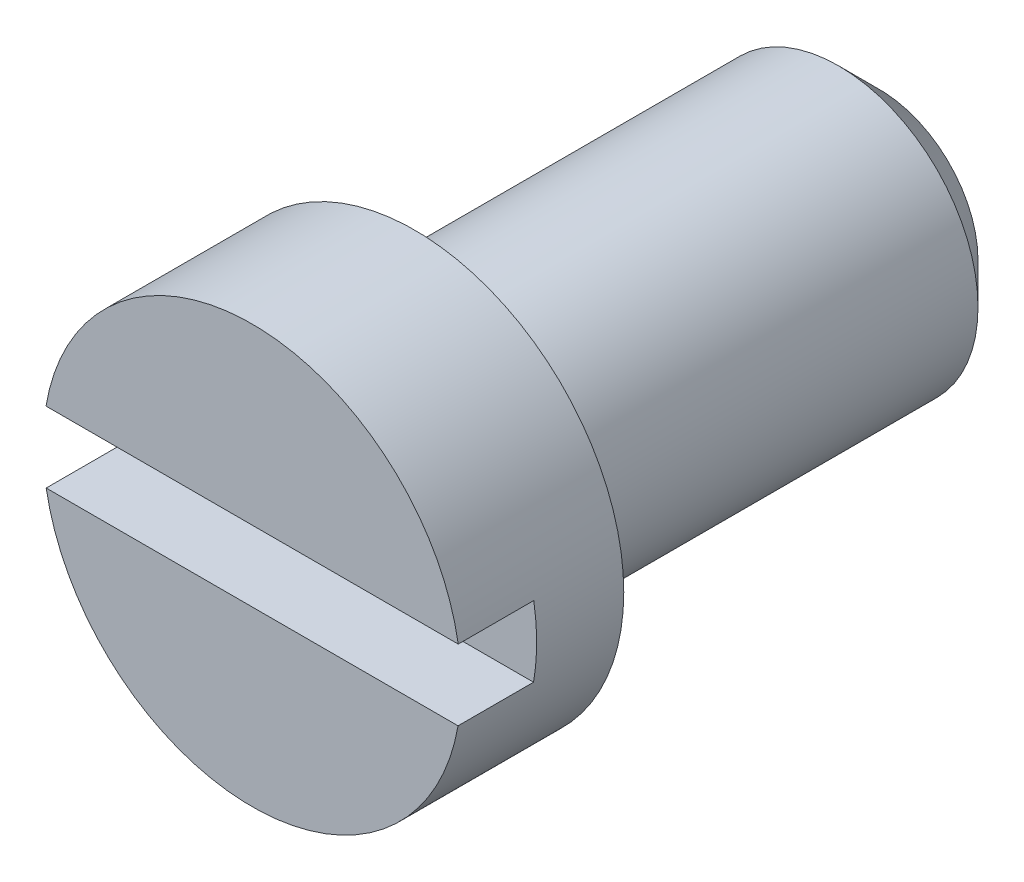
ISO-10303-21;
HEADER;
FILE_DESCRIPTION(('STEP AP214'),'2;1');
FILE_NAME('part.step','',(''),(''),'','','');
FILE_SCHEMA(('AUTOMOTIVE_DESIGN { 1 0 10303 214 1 1 1 1 }'));
ENDSEC;
DATA;
#1=APPLICATION_CONTEXT('core data for automotive mechanical design processes');
#2=APPLICATION_PROTOCOL_DEFINITION('international standard','automotive_design',2000,#1);
#3=PRODUCT_CONTEXT('',#1,'mechanical');
#4=PRODUCT('Part','Part','',(#3));
#5=PRODUCT_RELATED_PRODUCT_CATEGORY('part','',(#4));
#6=PRODUCT_DEFINITION_FORMATION('','',#4);
#7=PRODUCT_DEFINITION_CONTEXT('part definition',#1,'design');
#8=PRODUCT_DEFINITION('design','',#6,#7);
#9=PRODUCT_DEFINITION_SHAPE('','',#8);
#10=(LENGTH_UNIT() NAMED_UNIT(*) SI_UNIT(.MILLI.,.METRE.));
#11=(NAMED_UNIT(*) PLANE_ANGLE_UNIT() SI_UNIT($,.RADIAN.));
#12=(NAMED_UNIT(*) SI_UNIT($,.STERADIAN.) SOLID_ANGLE_UNIT());
#13=UNCERTAINTY_MEASURE_WITH_UNIT(LENGTH_MEASURE(1.E-05),#10,'distance_accuracy_value','');
#14=(GEOMETRIC_REPRESENTATION_CONTEXT(3) GLOBAL_UNCERTAINTY_ASSIGNED_CONTEXT((#13)) GLOBAL_UNIT_ASSIGNED_CONTEXT((#10,
#11,#12)) REPRESENTATION_CONTEXT('',''));
#15=CARTESIAN_POINT('',(0.,0.,0.));
#16=DIRECTION('',(0.,0.,1.));
#17=DIRECTION('',(1.,0.,0.));
#18=AXIS2_PLACEMENT_3D('',#15,#16,#17);
#19=CARTESIAN_POINT('',(0.,0.,7.));
#20=DIRECTION('',(0.,0.,1.));
#21=DIRECTION('',(1.,0.,0.));
#22=AXIS2_PLACEMENT_3D('',#19,#20,#21);
#23=PLANE('',#22);
#24=DIRECTION('',(-1.,0.,0.));
#25=VECTOR('',#24,1.);
#26=CARTESIAN_POINT('',(0.,1.5,7.));
#27=LINE('',#26,#25);
#28=CARTESIAN_POINT('',(8.87411967464942,1.5,7.));
#29=VERTEX_POINT('',#28);
#30=CARTESIAN_POINT('',(-8.87411967464942,1.5,7.));
#31=VERTEX_POINT('',#30);
#32=EDGE_CURVE('E77',#29,#31,#27,.T.);
#33=ORIENTED_EDGE('',*,*,#32,.F.);
#34=CARTESIAN_POINT('',(0.,0.,7.));
#35=DIRECTION('',(0.,0.,1.));
#36=DIRECTION('',(1.,0.,0.));
#37=AXIS2_PLACEMENT_3D('',#34,#35,#36);
#38=CIRCLE('',#37,9.);
#39=EDGE_CURVE('E90',#29,#31,#38,.T.);
#40=ORIENTED_EDGE('',*,*,#39,.T.);
#41=EDGE_LOOP('',(#33,#40));
#42=FACE_BOUND('',#41,.T.);
#43=ADVANCED_FACE('F29',(#42),#23,.T.);
#44=CARTESIAN_POINT('',(0.,0.,0.));
#45=DIRECTION('',(0.,0.,1.));
#46=DIRECTION('',(1.,0.,0.));
#47=AXIS2_PLACEMENT_3D('',#44,#45,#46);
#48=PLANE('',#47);
#49=CARTESIAN_POINT('',(0.,0.,0.));
#50=DIRECTION('',(0.,0.,1.));
#51=DIRECTION('',(1.,0.,0.));
#52=AXIS2_PLACEMENT_3D('',#49,#50,#51);
#53=CIRCLE('',#52,9.);
#54=CARTESIAN_POINT('',(9.,0.,0.));
#55=VERTEX_POINT('',#54);
#56=EDGE_CURVE('E91',#55,#55,#53,.T.);
#57=ORIENTED_EDGE('',*,*,#56,.F.);
#58=EDGE_LOOP('',(#57));
#59=FACE_BOUND('',#58,.T.);
#60=CARTESIAN_POINT('',(0.,0.,0.));
#61=DIRECTION('',(0.,0.,1.));
#62=DIRECTION('',(1.,0.,0.));
#63=AXIS2_PLACEMENT_3D('',#60,#61,#62);
#64=CIRCLE('',#63,6.);
#65=CARTESIAN_POINT('',(6.,0.,0.));
#66=VERTEX_POINT('',#65);
#67=EDGE_CURVE('E78',#66,#66,#64,.F.);
#68=ORIENTED_EDGE('',*,*,#67,.F.);
#69=EDGE_LOOP('',(#68));
#70=FACE_BOUND('',#69,.T.);
#71=ADVANCED_FACE('F118',(#59,#70),#48,.F.);
#72=CARTESIAN_POINT('',(0.,0.,7.));
#73=DIRECTION('',(0.,0.,-1.));
#74=DIRECTION('',(-1.,0.,0.));
#75=AXIS2_PLACEMENT_3D('',#72,#73,#74);
#76=CYLINDRICAL_SURFACE('',#75,9.);
#77=CARTESIAN_POINT('',(0.,0.,3.75));
#78=DIRECTION('',(0.,0.,1.));
#79=DIRECTION('',(1.,0.,0.));
#80=AXIS2_PLACEMENT_3D('',#77,#78,#79);
#81=CIRCLE('',#80,9.);
#82=CARTESIAN_POINT('',(-8.87411967464942,1.5,3.75));
#83=VERTEX_POINT('',#82);
#84=CARTESIAN_POINT('',(-8.86552310921358,-1.55,3.75));
#85=VERTEX_POINT('',#84);
#86=EDGE_CURVE('E102',#83,#85,#81,.T.);
#87=ORIENTED_EDGE('',*,*,#86,.F.);
#88=DIRECTION('',(0.,0.,-1.));
#89=VECTOR('',#88,1.);
#90=CARTESIAN_POINT('',(-8.87411967464942,1.5,7.));
#91=LINE('',#90,#89);
#92=EDGE_CURVE('E52',#83,#31,#91,.F.);
#93=ORIENTED_EDGE('',*,*,#92,.T.);
#94=ORIENTED_EDGE('',*,*,#39,.F.);
#95=DIRECTION('',(0.,0.,-1.));
#96=VECTOR('',#95,1.);
#97=CARTESIAN_POINT('',(8.87411967464942,1.5,7.));
#98=LINE('',#97,#96);
#99=CARTESIAN_POINT('',(8.87411967464942,1.5,3.75));
#100=VERTEX_POINT('',#99);
#101=EDGE_CURVE('E95',#29,#100,#98,.T.);
#102=ORIENTED_EDGE('',*,*,#101,.T.);
#103=CARTESIAN_POINT('',(8.86552310921358,-1.55,3.75));
#104=VERTEX_POINT('',#103);
#105=EDGE_CURVE('E86',#104,#100,#81,.T.);
#106=ORIENTED_EDGE('',*,*,#105,.F.);
#107=DIRECTION('',(0.,0.,-1.));
#108=VECTOR('',#107,1.);
#109=CARTESIAN_POINT('',(8.86552310921358,-1.55,7.));
#110=LINE('',#109,#108);
#111=CARTESIAN_POINT('',(8.86552310921357,-1.55,7.));
#112=VERTEX_POINT('',#111);
#113=EDGE_CURVE('E72',#104,#112,#110,.F.);
#114=ORIENTED_EDGE('',*,*,#113,.T.);
#115=CARTESIAN_POINT('',(-8.86552310921358,-1.55,7.));
#116=VERTEX_POINT('',#115);
#117=EDGE_CURVE('E84',#116,#112,#38,.T.);
#118=ORIENTED_EDGE('',*,*,#117,.F.);
#119=DIRECTION('',(0.,0.,-1.));
#120=VECTOR('',#119,1.);
#121=CARTESIAN_POINT('',(-8.86552310921358,-1.55,7.));
#122=LINE('',#121,#120);
#123=EDGE_CURVE('E44',#116,#85,#122,.T.);
#124=ORIENTED_EDGE('',*,*,#123,.T.);
#125=EDGE_LOOP('',(#87,#93,#94,#102,#106,#114,#118,#124));
#126=FACE_BOUND('',#125,.T.);
#127=ORIENTED_EDGE('',*,*,#56,.T.);
#128=EDGE_LOOP('',(#127));
#129=FACE_BOUND('',#128,.T.);
#130=ADVANCED_FACE('F31',(#126,#129),#76,.T.);
#131=DIRECTION('',(1.,0.,0.));
#132=VECTOR('',#131,1.);
#133=CARTESIAN_POINT('',(0.,-1.55,7.));
#134=LINE('',#133,#132);
#135=EDGE_CURVE('E69',#116,#112,#134,.T.);
#136=ORIENTED_EDGE('',*,*,#135,.F.);
#137=ORIENTED_EDGE('',*,*,#117,.T.);
#138=EDGE_LOOP('',(#136,#137));
#139=FACE_BOUND('',#138,.T.);
#140=ADVANCED_FACE('F89',(#139),#23,.T.);
#141=CARTESIAN_POINT('',(0.,0.,-20.));
#142=DIRECTION('',(0.,0.,1.));
#143=DIRECTION('',(1.,0.,0.));
#144=AXIS2_PLACEMENT_3D('',#141,#142,#143);
#145=CYLINDRICAL_SURFACE('',#144,6.);
#146=CARTESIAN_POINT('',(0.,0.,-18.25));
#147=DIRECTION('',(0.,0.,-1.));
#148=DIRECTION('',(-1.,0.,0.));
#149=AXIS2_PLACEMENT_3D('',#146,#147,#148);
#150=CIRCLE('',#149,6.);
#151=CARTESIAN_POINT('',(6.,0.,-18.25));
#152=VERTEX_POINT('',#151);
#153=EDGE_CURVE('E11',#152,#152,#150,.F.);
#154=ORIENTED_EDGE('',*,*,#153,.T.);
#155=EDGE_LOOP('',(#154));
#156=FACE_BOUND('',#155,.T.);
#157=ORIENTED_EDGE('',*,*,#67,.T.);
#158=EDGE_LOOP('',(#157));
#159=FACE_BOUND('',#158,.T.);
#160=ADVANCED_FACE('F126',(#156,#159),#145,.T.);
#161=CARTESIAN_POINT('',(0.,0.,-20.));
#162=DIRECTION('',(0.,0.,-1.));
#163=DIRECTION('',(-1.,0.,0.));
#164=AXIS2_PLACEMENT_3D('',#161,#162,#163);
#165=PLANE('',#164);
#166=CARTESIAN_POINT('',(0.,0.,-20.));
#167=DIRECTION('',(0.,0.,-1.));
#168=DIRECTION('',(-1.,0.,0.));
#169=AXIS2_PLACEMENT_3D('',#166,#167,#168);
#170=CIRCLE('',#169,4.25);
#171=CARTESIAN_POINT('',(4.25000000000001,0.,-20.));
#172=VERTEX_POINT('',#171);
#173=EDGE_CURVE('E37',#172,#172,#170,.T.);
#174=ORIENTED_EDGE('',*,*,#173,.T.);
#175=EDGE_LOOP('',(#174));
#176=FACE_BOUND('',#175,.T.);
#177=ADVANCED_FACE('F131',(#176),#165,.T.);
#178=CARTESIAN_POINT('',(-9.55182072829131,-1.55,3.75));
#179=DIRECTION('',(0.,0.,1.));
#180=DIRECTION('',(1.,0.,0.));
#181=AXIS2_PLACEMENT_3D('',#178,#179,#180);
#182=PLANE('',#181);
#183=ORIENTED_EDGE('',*,*,#86,.T.);
#184=DIRECTION('',(1.,0.,0.));
#185=VECTOR('',#184,1.);
#186=CARTESIAN_POINT('',(-9.55182072829131,-1.55,3.75));
#187=LINE('',#186,#185);
#188=EDGE_CURVE('E108',#85,#104,#187,.T.);
#189=ORIENTED_EDGE('',*,*,#188,.T.);
#190=ORIENTED_EDGE('',*,*,#105,.T.);
#191=DIRECTION('',(-1.,0.,0.));
#192=VECTOR('',#191,1.);
#193=CARTESIAN_POINT('',(-9.55182072829131,1.5,3.75));
#194=LINE('',#193,#192);
#195=EDGE_CURVE('E87',#100,#83,#194,.T.);
#196=ORIENTED_EDGE('',*,*,#195,.T.);
#197=EDGE_LOOP('',(#183,#189,#190,#196));
#198=FACE_BOUND('',#197,.T.);
#199=ADVANCED_FACE('F107',(#198),#182,.T.);
#200=CARTESIAN_POINT('',(-9.55182072829131,1.5,3.75));
#201=DIRECTION('',(0.,1.,0.));
#202=DIRECTION('',(0.,0.,1.));
#203=AXIS2_PLACEMENT_3D('',#200,#201,#202);
#204=PLANE('',#203);
#205=ORIENTED_EDGE('',*,*,#32,.T.);
#206=ORIENTED_EDGE('',*,*,#92,.F.);
#207=ORIENTED_EDGE('',*,*,#195,.F.);
#208=ORIENTED_EDGE('',*,*,#101,.F.);
#209=EDGE_LOOP('',(#205,#206,#207,#208));
#210=FACE_BOUND('',#209,.T.);
#211=ADVANCED_FACE('F115',(#210),#204,.F.);
#212=CARTESIAN_POINT('',(-9.55182072829131,-1.55,3.75));
#213=DIRECTION('',(0.,-1.,0.));
#214=DIRECTION('',(0.,0.,-1.));
#215=AXIS2_PLACEMENT_3D('',#212,#213,#214);
#216=PLANE('',#215);
#217=ORIENTED_EDGE('',*,*,#135,.T.);
#218=ORIENTED_EDGE('',*,*,#113,.F.);
#219=ORIENTED_EDGE('',*,*,#188,.F.);
#220=ORIENTED_EDGE('',*,*,#123,.F.);
#221=EDGE_LOOP('',(#217,#218,#219,#220));
#222=FACE_BOUND('',#221,.T.);
#223=ADVANCED_FACE('F71',(#222),#216,.F.);
#224=CARTESIAN_POINT('',(0.,0.,-20.));
#225=DIRECTION('',(0.,0.,1.));
#226=DIRECTION('',(1.,0.,0.));
#227=AXIS2_PLACEMENT_3D('',#224,#225,#226);
#228=CONICAL_SURFACE('',#227,4.25,0.785398163397446);
#229=CARTESIAN_POINT('',(6.,0.,-18.25));
#230=CARTESIAN_POINT('',(5.98177083333334,0.,-18.2682291666667));
#231=CARTESIAN_POINT('',(5.96354166666667,0.,-18.2864583333333));
#232=CARTESIAN_POINT('',(5.92708333333334,0.,-18.3229166666667));
#233=CARTESIAN_POINT('',(5.90885416666667,0.,-18.3411458333333));
#234=CARTESIAN_POINT('',(5.87239583333334,0.,-18.3776041666667));
#235=CARTESIAN_POINT('',(5.85416666666667,0.,-18.3958333333333));
#236=CARTESIAN_POINT('',(5.81770833333334,0.,-18.4322916666667));
#237=CARTESIAN_POINT('',(5.79947916666667,0.,-18.4505208333333));
#238=CARTESIAN_POINT('',(5.76302083333334,0.,-18.4869791666667));
#239=CARTESIAN_POINT('',(5.74479166666667,0.,-18.5052083333333));
#240=CARTESIAN_POINT('',(5.70833333333334,0.,-18.5416666666667));
#241=CARTESIAN_POINT('',(5.69010416666667,0.,-18.5598958333333));
#242=CARTESIAN_POINT('',(5.65364583333334,0.,-18.5963541666667));
#243=CARTESIAN_POINT('',(5.63541666666667,0.,-18.6145833333333));
#244=CARTESIAN_POINT('',(5.59895833333334,0.,-18.6510416666667));
#245=CARTESIAN_POINT('',(5.58072916666667,0.,-18.6692708333333));
#246=CARTESIAN_POINT('',(5.54427083333334,0.,-18.7057291666667));
#247=CARTESIAN_POINT('',(5.52604166666667,0.,-18.7239583333333));
#248=CARTESIAN_POINT('',(5.48958333333334,0.,-18.7604166666667));
#249=CARTESIAN_POINT('',(5.47135416666667,0.,-18.7786458333333));
#250=CARTESIAN_POINT('',(5.43489583333334,0.,-18.8151041666667));
#251=CARTESIAN_POINT('',(5.41666666666667,0.,-18.8333333333333));
#252=CARTESIAN_POINT('',(5.38020833333334,0.,-18.8697916666667));
#253=CARTESIAN_POINT('',(5.36197916666667,0.,-18.8880208333333));
#254=CARTESIAN_POINT('',(5.32552083333334,0.,-18.9244791666667));
#255=CARTESIAN_POINT('',(5.30729166666667,0.,-18.9427083333333));
#256=CARTESIAN_POINT('',(5.27083333333334,0.,-18.9791666666667));
#257=CARTESIAN_POINT('',(5.25260416666667,0.,-18.9973958333333));
#258=CARTESIAN_POINT('',(5.21614583333334,0.,-19.0338541666667));
#259=CARTESIAN_POINT('',(5.19791666666667,0.,-19.0520833333333));
#260=CARTESIAN_POINT('',(5.16145833333334,0.,-19.0885416666667));
#261=CARTESIAN_POINT('',(5.14322916666667,0.,-19.1067708333333));
#262=CARTESIAN_POINT('',(5.10677083333334,0.,-19.1432291666667));
#263=CARTESIAN_POINT('',(5.08854166666667,0.,-19.1614583333333));
#264=CARTESIAN_POINT('',(5.05208333333334,0.,-19.1979166666667));
#265=CARTESIAN_POINT('',(5.03385416666667,0.,-19.2161458333333));
#266=CARTESIAN_POINT('',(4.99739583333334,0.,-19.2526041666667));
#267=CARTESIAN_POINT('',(4.97916666666667,0.,-19.2708333333333));
#268=CARTESIAN_POINT('',(4.94270833333334,0.,-19.3072916666667));
#269=CARTESIAN_POINT('',(4.92447916666667,0.,-19.3255208333333));
#270=CARTESIAN_POINT('',(4.88802083333334,0.,-19.3619791666667));
#271=CARTESIAN_POINT('',(4.86979166666667,0.,-19.3802083333333));
#272=CARTESIAN_POINT('',(4.83333333333334,0.,-19.4166666666667));
#273=CARTESIAN_POINT('',(4.81510416666667,0.,-19.4348958333333));
#274=CARTESIAN_POINT('',(4.77864583333334,0.,-19.4713541666667));
#275=CARTESIAN_POINT('',(4.76041666666667,0.,-19.4895833333333));
#276=CARTESIAN_POINT('',(4.72395833333334,0.,-19.5260416666667));
#277=CARTESIAN_POINT('',(4.70572916666667,0.,-19.5442708333333));
#278=CARTESIAN_POINT('',(4.66927083333334,0.,-19.5807291666667));
#279=CARTESIAN_POINT('',(4.65104166666667,0.,-19.5989583333333));
#280=CARTESIAN_POINT('',(4.61458333333334,0.,-19.6354166666667));
#281=CARTESIAN_POINT('',(4.59635416666667,0.,-19.6536458333333));
#282=CARTESIAN_POINT('',(4.55989583333334,0.,-19.6901041666667));
#283=CARTESIAN_POINT('',(4.54166666666667,0.,-19.7083333333333));
#284=CARTESIAN_POINT('',(4.50520833333334,0.,-19.7447916666667));
#285=CARTESIAN_POINT('',(4.48697916666667,0.,-19.7630208333333));
#286=CARTESIAN_POINT('',(4.45052083333334,0.,-19.7994791666667));
#287=CARTESIAN_POINT('',(4.43229166666667,0.,-19.8177083333333));
#288=CARTESIAN_POINT('',(4.39583333333334,0.,-19.8541666666667));
#289=CARTESIAN_POINT('',(4.37760416666667,0.,-19.8723958333333));
#290=CARTESIAN_POINT('',(4.34114583333334,0.,-19.9088541666667));
#291=CARTESIAN_POINT('',(4.32291666666667,0.,-19.9270833333333));
#292=CARTESIAN_POINT('',(4.28645833333334,0.,-19.9635416666667));
#293=CARTESIAN_POINT('',(4.26822916666667,0.,-19.9817708333333));
#294=CARTESIAN_POINT('',(4.25000000000001,0.,-20.));
#295=B_SPLINE_CURVE_WITH_KNOTS('',3,(#229,#230,#231,#232,#233,#234,#235,#236,#237,#238,#239,
#240,#241,#242,#243,#244,#245,#246,#247,#248,#249,#250,#251,#252,#253,#254,#255,#256,#257,#258,
#259,#260,#261,#262,#263,#264,#265,#266,#267,#268,#269,#270,#271,#272,#273,#274,#275,#276,#277,
#278,#279,#280,#281,#282,#283,#284,#285,#286,#287,#288,#289,#290,#291,#292,#293,#294),
.UNSPECIFIED.,.F.,.F.,(4,2,2,2,2,2,2,2,2,2,2,2,2,2,2,2,2,2,2,2,2,2,2,2,2,2,2,2,2,2,2,2,4),(0.,
0.0773398041922793,0.154679608384558,0.232019412576837,0.309359216769117,0.386699020961394,
0.464038825153673,0.541378629345952,0.618718433538232,0.696058237730508,0.773398041922787,
0.850737846115067,0.928077650307346,1.00541745449963,1.0827572586919,1.16009706288418,
1.23743686707646,1.31477667126874,1.39211647546102,1.4694562796533,1.54679608384557,
1.62413588803785,1.70147569223013,1.77881549642241,1.85615530061469,1.93349510480697,
2.01083490899925,2.08817471319153,2.1655145173838,2.24285432157608,2.32019412576836,
2.39753392996064,2.47487373415292),.UNSPECIFIED.);
#296=EDGE_CURVE('BSEAM173',#152,#172,#295,.T.);
#297=ORIENTED_EDGE('',*,*,#153,.F.);
#298=ORIENTED_EDGE('',*,*,#173,.F.);
#299=ORIENTED_EDGE('',*,*,#296,.T.);
#300=ORIENTED_EDGE('',*,*,#296,.F.);
#301=EDGE_LOOP('',(#297,#299,#298,#300));
#302=FACE_BOUND('',#301,.T.);
#303=ADVANCED_FACE('F173',(#302),#228,.T.);
#304=CLOSED_SHELL('',(#43,#71,#130,#140,#160,#177,#199,#211,#223,#303));
#305=MANIFOLD_SOLID_BREP('B2',#304);
#306=ADVANCED_BREP_SHAPE_REPRESENTATION('',(#18,#305),#14);
#307=SHAPE_DEFINITION_REPRESENTATION(#9,#306);
ENDSEC;
END-ISO-10303-21;
